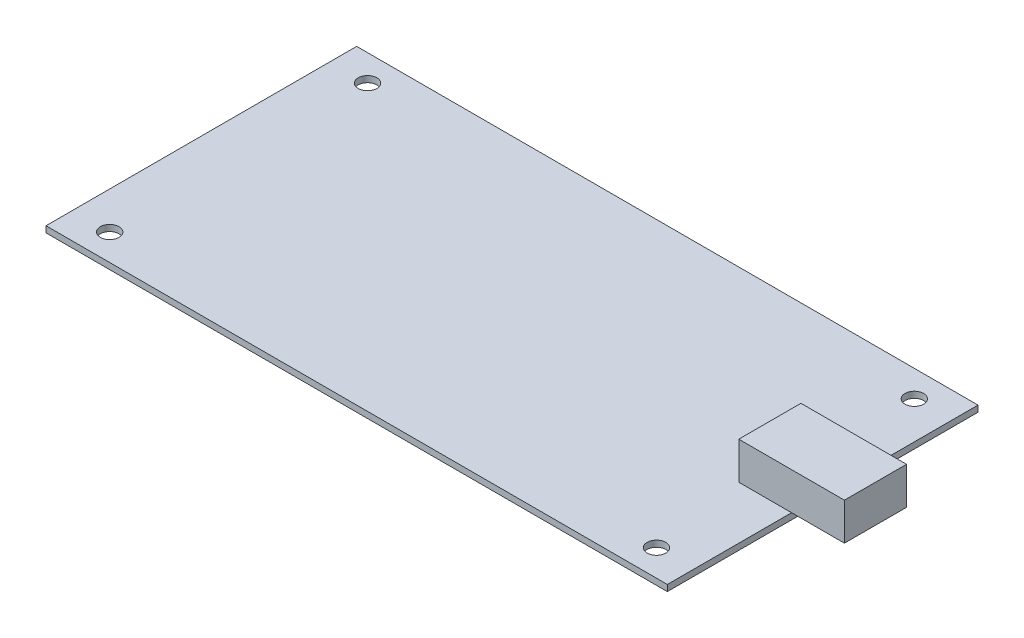
ISO-10303-21;
HEADER;
FILE_DESCRIPTION(('STEP AP214'),'2;1');
FILE_NAME('part.step','',(''),(''),'','','');
FILE_SCHEMA(('AUTOMOTIVE_DESIGN { 1 0 10303 214 1 1 1 1 }'));
ENDSEC;
DATA;
#1=APPLICATION_CONTEXT('core data for automotive mechanical design processes');
#2=APPLICATION_PROTOCOL_DEFINITION('international standard','automotive_design',2000,#1);
#3=PRODUCT_CONTEXT('',#1,'mechanical');
#4=PRODUCT('Part','Part','',(#3));
#5=PRODUCT_RELATED_PRODUCT_CATEGORY('part','',(#4));
#6=PRODUCT_DEFINITION_FORMATION('','',#4);
#7=PRODUCT_DEFINITION_CONTEXT('part definition',#1,'design');
#8=PRODUCT_DEFINITION('design','',#6,#7);
#9=PRODUCT_DEFINITION_SHAPE('','',#8);
#10=(LENGTH_UNIT() NAMED_UNIT(*) SI_UNIT(.MILLI.,.METRE.));
#11=(NAMED_UNIT(*) PLANE_ANGLE_UNIT() SI_UNIT($,.RADIAN.));
#12=(NAMED_UNIT(*) SI_UNIT($,.STERADIAN.) SOLID_ANGLE_UNIT());
#13=UNCERTAINTY_MEASURE_WITH_UNIT(LENGTH_MEASURE(1.E-05),#10,'distance_accuracy_value','');
#14=(GEOMETRIC_REPRESENTATION_CONTEXT(3) GLOBAL_UNCERTAINTY_ASSIGNED_CONTEXT((#13)) GLOBAL_UNIT_ASSIGNED_CONTEXT((#10,
#11,#12)) REPRESENTATION_CONTEXT('',''));
#15=CARTESIAN_POINT('',(0.,0.,0.));
#16=DIRECTION('',(0.,0.,1.));
#17=DIRECTION('',(1.,0.,0.));
#18=AXIS2_PLACEMENT_3D('',#15,#16,#17);
#19=CARTESIAN_POINT('',(0.,0.,0.));
#20=DIRECTION('',(0.,-1.,0.));
#21=DIRECTION('',(0.,0.,-1.));
#22=AXIS2_PLACEMENT_3D('',#19,#20,#21);
#23=PLANE('',#22);
#24=CARTESIAN_POINT('',(-44.,0.,-20.75));
#25=DIRECTION('',(0.,1.,0.));
#26=DIRECTION('',(0.,0.,1.));
#27=AXIS2_PLACEMENT_3D('',#24,#25,#26);
#28=CIRCLE('',#27,1.50000000000002);
#29=CARTESIAN_POINT('',(-44.,0.,-19.25));
#30=VERTEX_POINT('',#29);
#31=EDGE_CURVE('E226',#30,#30,#28,.T.);
#32=ORIENTED_EDGE('',*,*,#31,.T.);
#33=EDGE_LOOP('',(#32));
#34=FACE_BOUND('',#33,.T.);
#35=DIRECTION('',(0.,0.,-1.));
#36=VECTOR('',#35,1.);
#37=CARTESIAN_POINT('',(50.,0.,25.));
#38=LINE('',#37,#36);
#39=CARTESIAN_POINT('',(50.,0.,25.));
#40=VERTEX_POINT('',#39);
#41=CARTESIAN_POINT('',(50.,0.,-25.));
#42=VERTEX_POINT('',#41);
#43=EDGE_CURVE('E135',#40,#42,#38,.T.);
#44=ORIENTED_EDGE('',*,*,#43,.F.);
#45=DIRECTION('',(1.,0.,0.));
#46=VECTOR('',#45,1.);
#47=CARTESIAN_POINT('',(-50.,0.,25.));
#48=LINE('',#47,#46);
#49=CARTESIAN_POINT('',(-50.,0.,25.));
#50=VERTEX_POINT('',#49);
#51=EDGE_CURVE('E158',#50,#40,#48,.T.);
#52=ORIENTED_EDGE('',*,*,#51,.F.);
#53=DIRECTION('',(0.,0.,1.));
#54=VECTOR('',#53,1.);
#55=CARTESIAN_POINT('',(-50.,0.,25.));
#56=LINE('',#55,#54);
#57=CARTESIAN_POINT('',(-50.,0.,-25.));
#58=VERTEX_POINT('',#57);
#59=EDGE_CURVE('E156',#58,#50,#56,.T.);
#60=ORIENTED_EDGE('',*,*,#59,.F.);
#61=DIRECTION('',(-1.,0.,0.));
#62=VECTOR('',#61,1.);
#63=CARTESIAN_POINT('',(-50.,0.,-25.));
#64=LINE('',#63,#62);
#65=EDGE_CURVE('E138',#42,#58,#64,.T.);
#66=ORIENTED_EDGE('',*,*,#65,.F.);
#67=EDGE_LOOP('',(#44,#52,#60,#66));
#68=FACE_BOUND('',#67,.T.);
#69=CARTESIAN_POINT('',(44.,0.,-20.75));
#70=DIRECTION('',(0.,1.,0.));
#71=DIRECTION('',(0.,0.,1.));
#72=AXIS2_PLACEMENT_3D('',#69,#70,#71);
#73=CIRCLE('',#72,1.50000000000002);
#74=CARTESIAN_POINT('',(44.,0.,-19.25));
#75=VERTEX_POINT('',#74);
#76=EDGE_CURVE('E195',#75,#75,#73,.T.);
#77=ORIENTED_EDGE('',*,*,#76,.T.);
#78=EDGE_LOOP('',(#77));
#79=FACE_BOUND('',#78,.T.);
#80=CARTESIAN_POINT('',(44.,0.,20.75));
#81=DIRECTION('',(0.,1.,0.));
#82=DIRECTION('',(0.,0.,1.));
#83=AXIS2_PLACEMENT_3D('',#80,#81,#82);
#84=CIRCLE('',#83,1.50000000000002);
#85=CARTESIAN_POINT('',(44.,0.,22.25));
#86=VERTEX_POINT('',#85);
#87=EDGE_CURVE('E214',#86,#86,#84,.T.);
#88=ORIENTED_EDGE('',*,*,#87,.T.);
#89=EDGE_LOOP('',(#88));
#90=FACE_BOUND('',#89,.T.);
#91=CARTESIAN_POINT('',(-44.,0.,20.75));
#92=DIRECTION('',(0.,1.,0.));
#93=DIRECTION('',(0.,0.,1.));
#94=AXIS2_PLACEMENT_3D('',#91,#92,#93);
#95=CIRCLE('',#94,1.50000000000002);
#96=CARTESIAN_POINT('',(-44.,0.,22.25));
#97=VERTEX_POINT('',#96);
#98=EDGE_CURVE('E220',#97,#97,#95,.T.);
#99=ORIENTED_EDGE('',*,*,#98,.T.);
#100=EDGE_LOOP('',(#99));
#101=FACE_BOUND('',#100,.T.);
#102=ADVANCED_FACE('F39',(#34,#68,#79,#90,#101),#23,.T.);
#103=CARTESIAN_POINT('',(0.,1.,0.));
#104=DIRECTION('',(0.,-1.,0.));
#105=DIRECTION('',(0.,0.,-1.));
#106=AXIS2_PLACEMENT_3D('',#103,#104,#105);
#107=PLANE('',#106);
#108=CARTESIAN_POINT('',(-44.,1.,-20.75));
#109=DIRECTION('',(0.,1.,0.));
#110=DIRECTION('',(0.,0.,1.));
#111=AXIS2_PLACEMENT_3D('',#108,#109,#110);
#112=CIRCLE('',#111,1.50000000000002);
#113=CARTESIAN_POINT('',(-44.,1.,-19.25));
#114=VERTEX_POINT('',#113);
#115=EDGE_CURVE('E229',#114,#114,#112,.T.);
#116=ORIENTED_EDGE('',*,*,#115,.F.);
#117=EDGE_LOOP('',(#116));
#118=FACE_BOUND('',#117,.T.);
#119=CARTESIAN_POINT('',(-44.,1.,20.75));
#120=DIRECTION('',(0.,1.,0.));
#121=DIRECTION('',(0.,0.,1.));
#122=AXIS2_PLACEMENT_3D('',#119,#120,#121);
#123=CIRCLE('',#122,1.50000000000002);
#124=CARTESIAN_POINT('',(-44.,1.,22.25));
#125=VERTEX_POINT('',#124);
#126=EDGE_CURVE('E223',#125,#125,#123,.T.);
#127=ORIENTED_EDGE('',*,*,#126,.F.);
#128=EDGE_LOOP('',(#127));
#129=FACE_BOUND('',#128,.T.);
#130=CARTESIAN_POINT('',(44.,1.,20.75));
#131=DIRECTION('',(0.,1.,0.));
#132=DIRECTION('',(0.,0.,1.));
#133=AXIS2_PLACEMENT_3D('',#130,#131,#132);
#134=CIRCLE('',#133,1.50000000000002);
#135=CARTESIAN_POINT('',(44.,1.,22.25));
#136=VERTEX_POINT('',#135);
#137=EDGE_CURVE('E217',#136,#136,#134,.T.);
#138=ORIENTED_EDGE('',*,*,#137,.F.);
#139=EDGE_LOOP('',(#138));
#140=FACE_BOUND('',#139,.T.);
#141=CARTESIAN_POINT('',(44.,1.,-20.75));
#142=DIRECTION('',(0.,1.,0.));
#143=DIRECTION('',(0.,0.,1.));
#144=AXIS2_PLACEMENT_3D('',#141,#142,#143);
#145=CIRCLE('',#144,1.50000000000002);
#146=CARTESIAN_POINT('',(44.,1.,-19.25));
#147=VERTEX_POINT('',#146);
#148=EDGE_CURVE('E211',#147,#147,#145,.T.);
#149=ORIENTED_EDGE('',*,*,#148,.F.);
#150=EDGE_LOOP('',(#149));
#151=FACE_BOUND('',#150,.T.);
#152=DIRECTION('',(1.,0.,0.));
#153=VECTOR('',#152,1.);
#154=CARTESIAN_POINT('',(41.5,1.,5.));
#155=LINE('',#154,#153);
#156=CARTESIAN_POINT('',(41.5,1.,5.));
#157=VERTEX_POINT('',#156);
#158=CARTESIAN_POINT('',(50.,1.,5.));
#159=VERTEX_POINT('',#158);
#160=EDGE_CURVE('E56',#157,#159,#155,.T.);
#161=ORIENTED_EDGE('',*,*,#160,.F.);
#162=DIRECTION('',(0.,0.,1.));
#163=VECTOR('',#162,1.);
#164=CARTESIAN_POINT('',(41.5,1.,5.));
#165=LINE('',#164,#163);
#166=CARTESIAN_POINT('',(41.5,1.,-5.));
#167=VERTEX_POINT('',#166);
#168=EDGE_CURVE('E193',#167,#157,#165,.T.);
#169=ORIENTED_EDGE('',*,*,#168,.F.);
#170=DIRECTION('',(-1.,0.,0.));
#171=VECTOR('',#170,1.);
#172=CARTESIAN_POINT('',(41.5,1.,-5.));
#173=LINE('',#172,#171);
#174=CARTESIAN_POINT('',(50.,1.,-5.));
#175=VERTEX_POINT('',#174);
#176=EDGE_CURVE('E11',#175,#167,#173,.T.);
#177=ORIENTED_EDGE('',*,*,#176,.F.);
#178=DIRECTION('',(0.,0.,-1.));
#179=VECTOR('',#178,1.);
#180=CARTESIAN_POINT('',(50.,1.,25.));
#181=LINE('',#180,#179);
#182=CARTESIAN_POINT('',(50.,1.,-25.));
#183=VERTEX_POINT('',#182);
#184=EDGE_CURVE('E148',#175,#183,#181,.T.);
#185=ORIENTED_EDGE('',*,*,#184,.T.);
#186=DIRECTION('',(-1.,0.,0.));
#187=VECTOR('',#186,1.);
#188=CARTESIAN_POINT('',(-50.,1.,-25.));
#189=LINE('',#188,#187);
#190=CARTESIAN_POINT('',(-50.,1.,-25.));
#191=VERTEX_POINT('',#190);
#192=EDGE_CURVE('E146',#183,#191,#189,.T.);
#193=ORIENTED_EDGE('',*,*,#192,.T.);
#194=DIRECTION('',(0.,0.,1.));
#195=VECTOR('',#194,1.);
#196=CARTESIAN_POINT('',(-50.,1.,25.));
#197=LINE('',#196,#195);
#198=CARTESIAN_POINT('',(-50.,1.,25.));
#199=VERTEX_POINT('',#198);
#200=EDGE_CURVE('E150',#191,#199,#197,.T.);
#201=ORIENTED_EDGE('',*,*,#200,.T.);
#202=DIRECTION('',(1.,0.,0.));
#203=VECTOR('',#202,1.);
#204=CARTESIAN_POINT('',(-50.,1.,25.));
#205=LINE('',#204,#203);
#206=CARTESIAN_POINT('',(50.,1.,25.));
#207=VERTEX_POINT('',#206);
#208=EDGE_CURVE('E152',#199,#207,#205,.T.);
#209=ORIENTED_EDGE('',*,*,#208,.T.);
#210=EDGE_CURVE('E144',#207,#159,#181,.T.);
#211=ORIENTED_EDGE('',*,*,#210,.T.);
#212=EDGE_LOOP('',(#161,#169,#177,#185,#193,#201,#209,#211));
#213=FACE_BOUND('',#212,.T.);
#214=ADVANCED_FACE('F187',(#118,#129,#140,#151,#213),#107,.F.);
#215=CARTESIAN_POINT('',(50.,1.,25.));
#216=DIRECTION('',(-1.,0.,0.));
#217=DIRECTION('',(0.,0.,1.));
#218=AXIS2_PLACEMENT_3D('',#215,#216,#217);
#219=PLANE('',#218);
#220=ORIENTED_EDGE('',*,*,#43,.T.);
#221=DIRECTION('',(0.,-1.,0.));
#222=VECTOR('',#221,1.);
#223=CARTESIAN_POINT('',(50.,1.,-25.));
#224=LINE('',#223,#222);
#225=EDGE_CURVE('E43',#183,#42,#224,.T.);
#226=ORIENTED_EDGE('',*,*,#225,.F.);
#227=ORIENTED_EDGE('',*,*,#184,.F.);
#228=EDGE_CURVE('E147',#159,#175,#181,.T.);
#229=ORIENTED_EDGE('',*,*,#228,.F.);
#230=ORIENTED_EDGE('',*,*,#210,.F.);
#231=DIRECTION('',(0.,-1.,0.));
#232=VECTOR('',#231,1.);
#233=CARTESIAN_POINT('',(50.,1.,25.));
#234=LINE('',#233,#232);
#235=EDGE_CURVE('E153',#207,#40,#234,.T.);
#236=ORIENTED_EDGE('',*,*,#235,.T.);
#237=EDGE_LOOP('',(#220,#226,#227,#229,#230,#236));
#238=FACE_BOUND('',#237,.T.);
#239=ADVANCED_FACE('F41',(#238),#219,.F.);
#240=CARTESIAN_POINT('',(-50.,1.,-25.));
#241=DIRECTION('',(0.,0.,1.));
#242=DIRECTION('',(1.,0.,0.));
#243=AXIS2_PLACEMENT_3D('',#240,#241,#242);
#244=PLANE('',#243);
#245=ORIENTED_EDGE('',*,*,#65,.T.);
#246=DIRECTION('',(0.,-1.,0.));
#247=VECTOR('',#246,1.);
#248=CARTESIAN_POINT('',(-50.,1.,-25.));
#249=LINE('',#248,#247);
#250=EDGE_CURVE('E164',#191,#58,#249,.T.);
#251=ORIENTED_EDGE('',*,*,#250,.F.);
#252=ORIENTED_EDGE('',*,*,#192,.F.);
#253=ORIENTED_EDGE('',*,*,#225,.T.);
#254=EDGE_LOOP('',(#245,#251,#252,#253));
#255=FACE_BOUND('',#254,.T.);
#256=ADVANCED_FACE('F174',(#255),#244,.F.);
#257=CARTESIAN_POINT('',(-50.,1.,25.));
#258=DIRECTION('',(1.,0.,0.));
#259=DIRECTION('',(0.,0.,-1.));
#260=AXIS2_PLACEMENT_3D('',#257,#258,#259);
#261=PLANE('',#260);
#262=ORIENTED_EDGE('',*,*,#59,.T.);
#263=DIRECTION('',(0.,-1.,0.));
#264=VECTOR('',#263,1.);
#265=CARTESIAN_POINT('',(-50.,1.,25.));
#266=LINE('',#265,#264);
#267=EDGE_CURVE('E162',#199,#50,#266,.T.);
#268=ORIENTED_EDGE('',*,*,#267,.F.);
#269=ORIENTED_EDGE('',*,*,#200,.F.);
#270=ORIENTED_EDGE('',*,*,#250,.T.);
#271=EDGE_LOOP('',(#262,#268,#269,#270));
#272=FACE_BOUND('',#271,.T.);
#273=ADVANCED_FACE('F183',(#272),#261,.F.);
#274=CARTESIAN_POINT('',(-50.,1.,25.));
#275=DIRECTION('',(0.,0.,-1.));
#276=DIRECTION('',(-1.,0.,0.));
#277=AXIS2_PLACEMENT_3D('',#274,#275,#276);
#278=PLANE('',#277);
#279=ORIENTED_EDGE('',*,*,#51,.T.);
#280=ORIENTED_EDGE('',*,*,#235,.F.);
#281=ORIENTED_EDGE('',*,*,#208,.F.);
#282=ORIENTED_EDGE('',*,*,#267,.T.);
#283=EDGE_LOOP('',(#279,#280,#281,#282));
#284=FACE_BOUND('',#283,.T.);
#285=ADVANCED_FACE('F186',(#284),#278,.F.);
#286=CARTESIAN_POINT('',(58.5,7.,5.));
#287=DIRECTION('',(-1.,0.,0.));
#288=DIRECTION('',(0.,0.,1.));
#289=AXIS2_PLACEMENT_3D('',#286,#287,#288);
#290=PLANE('',#289);
#291=DIRECTION('',(0.,0.,-1.));
#292=VECTOR('',#291,1.);
#293=CARTESIAN_POINT('',(58.5,1.,5.));
#294=LINE('',#293,#292);
#295=CARTESIAN_POINT('',(58.5,1.,5.));
#296=VERTEX_POINT('',#295);
#297=CARTESIAN_POINT('',(58.5,1.,-5.));
#298=VERTEX_POINT('',#297);
#299=EDGE_CURVE('E134',#296,#298,#294,.T.);
#300=ORIENTED_EDGE('',*,*,#299,.T.);
#301=DIRECTION('',(0.,-1.,0.));
#302=VECTOR('',#301,1.);
#303=CARTESIAN_POINT('',(58.5,7.,-5.));
#304=LINE('',#303,#302);
#305=CARTESIAN_POINT('',(58.5,7.,-5.));
#306=VERTEX_POINT('',#305);
#307=EDGE_CURVE('E115',#306,#298,#304,.T.);
#308=ORIENTED_EDGE('',*,*,#307,.F.);
#309=DIRECTION('',(0.,0.,-1.));
#310=VECTOR('',#309,1.);
#311=CARTESIAN_POINT('',(58.5,7.,5.));
#312=LINE('',#311,#310);
#313=CARTESIAN_POINT('',(58.5,7.,5.));
#314=VERTEX_POINT('',#313);
#315=EDGE_CURVE('E122',#314,#306,#312,.T.);
#316=ORIENTED_EDGE('',*,*,#315,.F.);
#317=DIRECTION('',(0.,-1.,0.));
#318=VECTOR('',#317,1.);
#319=CARTESIAN_POINT('',(58.5,7.,5.));
#320=LINE('',#319,#318);
#321=EDGE_CURVE('E200',#314,#296,#320,.T.);
#322=ORIENTED_EDGE('',*,*,#321,.T.);
#323=EDGE_LOOP('',(#300,#308,#316,#322));
#324=FACE_BOUND('',#323,.T.);
#325=ADVANCED_FACE('F132',(#324),#290,.F.);
#326=CARTESIAN_POINT('',(41.5,7.,-5.));
#327=DIRECTION('',(0.,0.,1.));
#328=DIRECTION('',(1.,0.,0.));
#329=AXIS2_PLACEMENT_3D('',#326,#327,#328);
#330=PLANE('',#329);
#331=EDGE_CURVE('E49',#298,#175,#173,.T.);
#332=ORIENTED_EDGE('',*,*,#331,.T.);
#333=ORIENTED_EDGE('',*,*,#176,.T.);
#334=DIRECTION('',(0.,-1.,0.));
#335=VECTOR('',#334,1.);
#336=CARTESIAN_POINT('',(41.5,7.,-5.));
#337=LINE('',#336,#335);
#338=CARTESIAN_POINT('',(41.5,7.,-5.));
#339=VERTEX_POINT('',#338);
#340=EDGE_CURVE('E118',#339,#167,#337,.T.);
#341=ORIENTED_EDGE('',*,*,#340,.F.);
#342=DIRECTION('',(-1.,0.,0.));
#343=VECTOR('',#342,1.);
#344=CARTESIAN_POINT('',(41.5,7.,-5.));
#345=LINE('',#344,#343);
#346=EDGE_CURVE('E110',#306,#339,#345,.T.);
#347=ORIENTED_EDGE('',*,*,#346,.F.);
#348=ORIENTED_EDGE('',*,*,#307,.T.);
#349=EDGE_LOOP('',(#332,#333,#341,#347,#348));
#350=FACE_BOUND('',#349,.T.);
#351=ADVANCED_FACE('F113',(#350),#330,.F.);
#352=CARTESIAN_POINT('',(41.5,7.,5.));
#353=DIRECTION('',(1.,0.,0.));
#354=DIRECTION('',(0.,0.,-1.));
#355=AXIS2_PLACEMENT_3D('',#352,#353,#354);
#356=PLANE('',#355);
#357=ORIENTED_EDGE('',*,*,#168,.T.);
#358=DIRECTION('',(0.,-1.,0.));
#359=VECTOR('',#358,1.);
#360=CARTESIAN_POINT('',(41.5,7.,5.));
#361=LINE('',#360,#359);
#362=CARTESIAN_POINT('',(41.5,7.,5.));
#363=VERTEX_POINT('',#362);
#364=EDGE_CURVE('E140',#363,#157,#361,.T.);
#365=ORIENTED_EDGE('',*,*,#364,.F.);
#366=DIRECTION('',(0.,0.,1.));
#367=VECTOR('',#366,1.);
#368=CARTESIAN_POINT('',(41.5,7.,5.));
#369=LINE('',#368,#367);
#370=EDGE_CURVE('E121',#339,#363,#369,.T.);
#371=ORIENTED_EDGE('',*,*,#370,.F.);
#372=ORIENTED_EDGE('',*,*,#340,.T.);
#373=EDGE_LOOP('',(#357,#365,#371,#372));
#374=FACE_BOUND('',#373,.T.);
#375=ADVANCED_FACE('F206',(#374),#356,.F.);
#376=CARTESIAN_POINT('',(41.5,7.,5.));
#377=DIRECTION('',(0.,0.,-1.));
#378=DIRECTION('',(-1.,0.,0.));
#379=AXIS2_PLACEMENT_3D('',#376,#377,#378);
#380=PLANE('',#379);
#381=ORIENTED_EDGE('',*,*,#160,.T.);
#382=EDGE_CURVE('E192',#159,#296,#155,.T.);
#383=ORIENTED_EDGE('',*,*,#382,.T.);
#384=ORIENTED_EDGE('',*,*,#321,.F.);
#385=DIRECTION('',(1.,0.,0.));
#386=VECTOR('',#385,1.);
#387=CARTESIAN_POINT('',(41.5,7.,5.));
#388=LINE('',#387,#386);
#389=EDGE_CURVE('E127',#363,#314,#388,.T.);
#390=ORIENTED_EDGE('',*,*,#389,.F.);
#391=ORIENTED_EDGE('',*,*,#364,.T.);
#392=EDGE_LOOP('',(#381,#383,#384,#390,#391));
#393=FACE_BOUND('',#392,.T.);
#394=ADVANCED_FACE('F204',(#393),#380,.F.);
#395=CARTESIAN_POINT('',(0.,7.,0.));
#396=DIRECTION('',(0.,-1.,0.));
#397=DIRECTION('',(0.,0.,-1.));
#398=AXIS2_PLACEMENT_3D('',#395,#396,#397);
#399=PLANE('',#398);
#400=ORIENTED_EDGE('',*,*,#315,.T.);
#401=ORIENTED_EDGE('',*,*,#346,.T.);
#402=ORIENTED_EDGE('',*,*,#370,.T.);
#403=ORIENTED_EDGE('',*,*,#389,.T.);
#404=EDGE_LOOP('',(#400,#401,#402,#403));
#405=FACE_BOUND('',#404,.T.);
#406=ADVANCED_FACE('F125',(#405),#399,.F.);
#407=CARTESIAN_POINT('',(0.,1.,0.));
#408=DIRECTION('',(0.,-1.,0.));
#409=DIRECTION('',(0.,0.,-1.));
#410=AXIS2_PLACEMENT_3D('',#407,#408,#409);
#411=PLANE('',#410);
#412=ORIENTED_EDGE('',*,*,#382,.F.);
#413=ORIENTED_EDGE('',*,*,#228,.T.);
#414=ORIENTED_EDGE('',*,*,#331,.F.);
#415=ORIENTED_EDGE('',*,*,#299,.F.);
#416=EDGE_LOOP('',(#412,#413,#414,#415));
#417=FACE_BOUND('',#416,.T.);
#418=ADVANCED_FACE('F191',(#417),#411,.T.);
#419=CARTESIAN_POINT('',(44.,1.,-20.75));
#420=DIRECTION('',(0.,1.,0.));
#421=DIRECTION('',(0.,0.,1.));
#422=AXIS2_PLACEMENT_3D('',#419,#420,#421);
#423=CYLINDRICAL_SURFACE('',#422,1.50000000000002);
#424=ORIENTED_EDGE('',*,*,#76,.F.);
#425=EDGE_LOOP('',(#424));
#426=FACE_BOUND('',#425,.T.);
#427=ORIENTED_EDGE('',*,*,#148,.T.);
#428=EDGE_LOOP('',(#427));
#429=FACE_BOUND('',#428,.T.);
#430=ADVANCED_FACE('F244',(#426,#429),#423,.F.);
#431=CARTESIAN_POINT('',(44.,1.,20.75));
#432=DIRECTION('',(0.,1.,0.));
#433=DIRECTION('',(0.,0.,1.));
#434=AXIS2_PLACEMENT_3D('',#431,#432,#433);
#435=CYLINDRICAL_SURFACE('',#434,1.50000000000002);
#436=ORIENTED_EDGE('',*,*,#87,.F.);
#437=EDGE_LOOP('',(#436));
#438=FACE_BOUND('',#437,.T.);
#439=ORIENTED_EDGE('',*,*,#137,.T.);
#440=EDGE_LOOP('',(#439));
#441=FACE_BOUND('',#440,.T.);
#442=ADVANCED_FACE('F246',(#438,#441),#435,.F.);
#443=CARTESIAN_POINT('',(-44.,1.,20.75));
#444=DIRECTION('',(0.,1.,0.));
#445=DIRECTION('',(0.,0.,1.));
#446=AXIS2_PLACEMENT_3D('',#443,#444,#445);
#447=CYLINDRICAL_SURFACE('',#446,1.50000000000002);
#448=ORIENTED_EDGE('',*,*,#98,.F.);
#449=EDGE_LOOP('',(#448));
#450=FACE_BOUND('',#449,.T.);
#451=ORIENTED_EDGE('',*,*,#126,.T.);
#452=EDGE_LOOP('',(#451));
#453=FACE_BOUND('',#452,.T.);
#454=ADVANCED_FACE('F252',(#450,#453),#447,.F.);
#455=CARTESIAN_POINT('',(-44.,1.,-20.75));
#456=DIRECTION('',(0.,1.,0.));
#457=DIRECTION('',(0.,0.,1.));
#458=AXIS2_PLACEMENT_3D('',#455,#456,#457);
#459=CYLINDRICAL_SURFACE('',#458,1.50000000000002);
#460=ORIENTED_EDGE('',*,*,#31,.F.);
#461=EDGE_LOOP('',(#460));
#462=FACE_BOUND('',#461,.T.);
#463=ORIENTED_EDGE('',*,*,#115,.T.);
#464=EDGE_LOOP('',(#463));
#465=FACE_BOUND('',#464,.T.);
#466=ADVANCED_FACE('F233',(#462,#465),#459,.F.);
#467=CLOSED_SHELL('',(#102,#214,#239,#256,#273,#285,#325,#351,#375,#394,#406,#418,#430,#442,
#454,#466));
#468=MANIFOLD_SOLID_BREP('B2',#467);
#469=ADVANCED_BREP_SHAPE_REPRESENTATION('',(#18,#468),#14);
#470=SHAPE_DEFINITION_REPRESENTATION(#9,#469);
ENDSEC;
END-ISO-10303-21;
